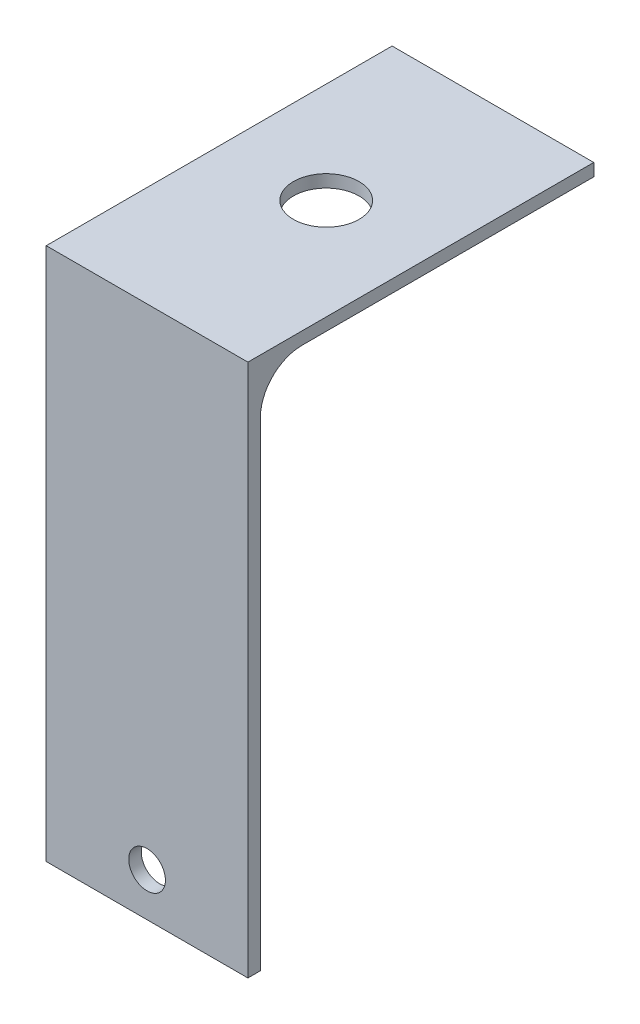
ISO-10303-21;
HEADER;
FILE_DESCRIPTION(('STEP AP214'),'2;1');
FILE_NAME('part.step','',(''),(''),'','','');
FILE_SCHEMA(('AUTOMOTIVE_DESIGN { 1 0 10303 214 1 1 1 1 }'));
ENDSEC;
DATA;
#1=APPLICATION_CONTEXT('core data for automotive mechanical design processes');
#2=APPLICATION_PROTOCOL_DEFINITION('international standard','automotive_design',2000,#1);
#3=PRODUCT_CONTEXT('',#1,'mechanical');
#4=PRODUCT('Part','Part','',(#3));
#5=PRODUCT_RELATED_PRODUCT_CATEGORY('part','',(#4));
#6=PRODUCT_DEFINITION_FORMATION('','',#4);
#7=PRODUCT_DEFINITION_CONTEXT('part definition',#1,'design');
#8=PRODUCT_DEFINITION('design','',#6,#7);
#9=PRODUCT_DEFINITION_SHAPE('','',#8);
#10=(LENGTH_UNIT() NAMED_UNIT(*) SI_UNIT(.MILLI.,.METRE.));
#11=(NAMED_UNIT(*) PLANE_ANGLE_UNIT() SI_UNIT($,.RADIAN.));
#12=(NAMED_UNIT(*) SI_UNIT($,.STERADIAN.) SOLID_ANGLE_UNIT());
#13=UNCERTAINTY_MEASURE_WITH_UNIT(LENGTH_MEASURE(1.E-05),#10,'distance_accuracy_value','');
#14=(GEOMETRIC_REPRESENTATION_CONTEXT(3) GLOBAL_UNCERTAINTY_ASSIGNED_CONTEXT((#13)) GLOBAL_UNIT_ASSIGNED_CONTEXT((#10,
#11,#12)) REPRESENTATION_CONTEXT('',''));
#15=CARTESIAN_POINT('',(0.,0.,0.));
#16=DIRECTION('',(0.,0.,1.));
#17=DIRECTION('',(1.,0.,0.));
#18=AXIS2_PLACEMENT_3D('',#15,#16,#17);
#19=CARTESIAN_POINT('',(0.,25.5,-5.));
#20=DIRECTION('',(-1.,0.,0.));
#21=DIRECTION('',(0.,0.,1.));
#22=AXIS2_PLACEMENT_3D('',#19,#20,#21);
#23=CYLINDRICAL_SURFACE('',#22,5.);
#24=DIRECTION('',(-1.,0.,0.));
#25=VECTOR('',#24,1.);
#26=CARTESIAN_POINT('',(0.,30.5,-5.));
#27=LINE('',#26,#25);
#28=CARTESIAN_POINT('',(12.1,30.5,-5.));
#29=VERTEX_POINT('',#28);
#30=CARTESIAN_POINT('',(-12.1,30.5,-5.));
#31=VERTEX_POINT('',#30);
#32=EDGE_CURVE('E183',#29,#31,#27,.T.);
#33=ORIENTED_EDGE('',*,*,#32,.F.);
#34=CARTESIAN_POINT('',(12.1,25.5,-5.));
#35=DIRECTION('',(-1.,0.,0.));
#36=DIRECTION('',(0.,0.,1.));
#37=AXIS2_PLACEMENT_3D('',#34,#35,#36);
#38=CIRCLE('',#37,5.);
#39=CARTESIAN_POINT('',(12.1,25.5,0.));
#40=VERTEX_POINT('',#39);
#41=EDGE_CURVE('E55',#29,#40,#38,.F.);
#42=ORIENTED_EDGE('',*,*,#41,.T.);
#43=DIRECTION('',(-1.,0.,0.));
#44=VECTOR('',#43,1.);
#45=CARTESIAN_POINT('',(0.,25.5,0.));
#46=LINE('',#45,#44);
#47=CARTESIAN_POINT('',(-12.1,25.5,0.));
#48=VERTEX_POINT('',#47);
#49=EDGE_CURVE('E186',#48,#40,#46,.F.);
#50=ORIENTED_EDGE('',*,*,#49,.F.);
#51=CARTESIAN_POINT('',(-12.1,25.5,-5.));
#52=DIRECTION('',(1.,0.,0.));
#53=DIRECTION('',(0.,0.,-1.));
#54=AXIS2_PLACEMENT_3D('',#51,#52,#53);
#55=CIRCLE('',#54,5.);
#56=EDGE_CURVE('E11',#48,#31,#55,.F.);
#57=ORIENTED_EDGE('',*,*,#56,.T.);
#58=EDGE_LOOP('',(#33,#42,#50,#57));
#59=FACE_BOUND('',#58,.T.);
#60=ADVANCED_FACE('F47',(#59),#23,.F.);
#61=CARTESIAN_POINT('',(-12.1,-32.,1.5));
#62=DIRECTION('',(1.,0.,0.));
#63=DIRECTION('',(0.,0.,-1.));
#64=AXIS2_PLACEMENT_3D('',#61,#62,#63);
#65=PLANE('',#64);
#66=ORIENTED_EDGE('',*,*,#56,.F.);
#67=DIRECTION('',(0.,-1.,0.));
#68=VECTOR('',#67,1.);
#69=CARTESIAN_POINT('',(-12.1,-32.,0.));
#70=LINE('',#69,#68);
#71=CARTESIAN_POINT('',(-12.1,-32.,0.));
#72=VERTEX_POINT('',#71);
#73=EDGE_CURVE('E144',#48,#72,#70,.T.);
#74=ORIENTED_EDGE('',*,*,#73,.T.);
#75=DIRECTION('',(0.,0.,-1.));
#76=VECTOR('',#75,1.);
#77=CARTESIAN_POINT('',(-12.1,-32.,1.5));
#78=LINE('',#77,#76);
#79=CARTESIAN_POINT('',(-12.1,-32.,1.5));
#80=VERTEX_POINT('',#79);
#81=EDGE_CURVE('E179',#80,#72,#78,.T.);
#82=ORIENTED_EDGE('',*,*,#81,.F.);
#83=DIRECTION('',(0.,-1.,0.));
#84=VECTOR('',#83,1.);
#85=CARTESIAN_POINT('',(-12.1,-32.,1.5));
#86=LINE('',#85,#84);
#87=CARTESIAN_POINT('',(-12.1,32.,1.5));
#88=VERTEX_POINT('',#87);
#89=EDGE_CURVE('E148',#88,#80,#86,.T.);
#90=ORIENTED_EDGE('',*,*,#89,.F.);
#91=DIRECTION('',(0.,0.,-1.));
#92=VECTOR('',#91,1.);
#93=CARTESIAN_POINT('',(-12.1,32.,1.5));
#94=LINE('',#93,#92);
#95=CARTESIAN_POINT('',(-12.1,32.,-40.));
#96=VERTEX_POINT('',#95);
#97=EDGE_CURVE('E162',#88,#96,#94,.T.);
#98=ORIENTED_EDGE('',*,*,#97,.T.);
#99=DIRECTION('',(0.,1.,0.));
#100=VECTOR('',#99,1.);
#101=CARTESIAN_POINT('',(-12.1,30.5,-40.));
#102=LINE('',#101,#100);
#103=CARTESIAN_POINT('',(-12.1,30.5,-40.));
#104=VERTEX_POINT('',#103);
#105=EDGE_CURVE('E124',#104,#96,#102,.T.);
#106=ORIENTED_EDGE('',*,*,#105,.F.);
#107=DIRECTION('',(0.,0.,1.));
#108=VECTOR('',#107,1.);
#109=CARTESIAN_POINT('',(-12.1,30.5,0.));
#110=LINE('',#109,#108);
#111=EDGE_CURVE('E115',#104,#31,#110,.T.);
#112=ORIENTED_EDGE('',*,*,#111,.T.);
#113=EDGE_LOOP('',(#66,#74,#82,#90,#98,#106,#112));
#114=FACE_BOUND('',#113,.T.);
#115=ADVANCED_FACE('F261',(#114),#65,.F.);
#116=CARTESIAN_POINT('',(12.1,-32.,1.5));
#117=DIRECTION('',(0.,1.,0.));
#118=DIRECTION('',(0.,0.,1.));
#119=AXIS2_PLACEMENT_3D('',#116,#117,#118);
#120=PLANE('',#119);
#121=DIRECTION('',(1.,0.,0.));
#122=VECTOR('',#121,1.);
#123=CARTESIAN_POINT('',(12.1,-32.,0.));
#124=LINE('',#123,#122);
#125=CARTESIAN_POINT('',(12.1,-32.,0.));
#126=VERTEX_POINT('',#125);
#127=EDGE_CURVE('E165',#72,#126,#124,.T.);
#128=ORIENTED_EDGE('',*,*,#127,.T.);
#129=DIRECTION('',(0.,0.,-1.));
#130=VECTOR('',#129,1.);
#131=CARTESIAN_POINT('',(12.1,-32.,1.5));
#132=LINE('',#131,#130);
#133=CARTESIAN_POINT('',(12.1,-32.,1.5));
#134=VERTEX_POINT('',#133);
#135=EDGE_CURVE('E175',#134,#126,#132,.T.);
#136=ORIENTED_EDGE('',*,*,#135,.F.);
#137=DIRECTION('',(1.,0.,0.));
#138=VECTOR('',#137,1.);
#139=CARTESIAN_POINT('',(12.1,-32.,1.5));
#140=LINE('',#139,#138);
#141=EDGE_CURVE('E152',#80,#134,#140,.T.);
#142=ORIENTED_EDGE('',*,*,#141,.F.);
#143=ORIENTED_EDGE('',*,*,#81,.T.);
#144=EDGE_LOOP('',(#128,#136,#142,#143));
#145=FACE_BOUND('',#144,.T.);
#146=ADVANCED_FACE('F265',(#145),#120,.F.);
#147=CARTESIAN_POINT('',(12.1,-32.,1.5));
#148=DIRECTION('',(-1.,0.,0.));
#149=DIRECTION('',(0.,0.,1.));
#150=AXIS2_PLACEMENT_3D('',#147,#148,#149);
#151=PLANE('',#150);
#152=ORIENTED_EDGE('',*,*,#41,.F.);
#153=DIRECTION('',(0.,0.,-1.));
#154=VECTOR('',#153,1.);
#155=CARTESIAN_POINT('',(12.1,30.5,0.));
#156=LINE('',#155,#154);
#157=CARTESIAN_POINT('',(12.1,30.5,-40.));
#158=VERTEX_POINT('',#157);
#159=EDGE_CURVE('E103',#29,#158,#156,.T.);
#160=ORIENTED_EDGE('',*,*,#159,.T.);
#161=DIRECTION('',(0.,1.,0.));
#162=VECTOR('',#161,1.);
#163=CARTESIAN_POINT('',(12.1,30.5,-40.));
#164=LINE('',#163,#162);
#165=CARTESIAN_POINT('',(12.1,32.,-40.));
#166=VERTEX_POINT('',#165);
#167=EDGE_CURVE('E107',#158,#166,#164,.T.);
#168=ORIENTED_EDGE('',*,*,#167,.T.);
#169=DIRECTION('',(0.,0.,-1.));
#170=VECTOR('',#169,1.);
#171=CARTESIAN_POINT('',(12.1,32.,1.5));
#172=LINE('',#171,#170);
#173=CARTESIAN_POINT('',(12.1,32.,1.5));
#174=VERTEX_POINT('',#173);
#175=EDGE_CURVE('E172',#174,#166,#172,.T.);
#176=ORIENTED_EDGE('',*,*,#175,.F.);
#177=DIRECTION('',(0.,1.,0.));
#178=VECTOR('',#177,1.);
#179=CARTESIAN_POINT('',(12.1,-32.,1.5));
#180=LINE('',#179,#178);
#181=EDGE_CURVE('E156',#134,#174,#180,.T.);
#182=ORIENTED_EDGE('',*,*,#181,.F.);
#183=ORIENTED_EDGE('',*,*,#135,.T.);
#184=DIRECTION('',(0.,1.,0.));
#185=VECTOR('',#184,1.);
#186=CARTESIAN_POINT('',(12.1,-32.,0.));
#187=LINE('',#186,#185);
#188=EDGE_CURVE('E153',#126,#40,#187,.T.);
#189=ORIENTED_EDGE('',*,*,#188,.T.);
#190=EDGE_LOOP('',(#152,#160,#168,#176,#182,#183,#189));
#191=FACE_BOUND('',#190,.T.);
#192=ADVANCED_FACE('F105',(#191),#151,.F.);
#193=CARTESIAN_POINT('',(12.1,32.,1.5));
#194=DIRECTION('',(0.,-1.,0.));
#195=DIRECTION('',(0.,0.,-1.));
#196=AXIS2_PLACEMENT_3D('',#193,#194,#195);
#197=PLANE('',#196);
#198=CARTESIAN_POINT('',(0.,32.,-20.));
#199=DIRECTION('',(0.,-1.,0.));
#200=DIRECTION('',(0.,0.,-1.));
#201=AXIS2_PLACEMENT_3D('',#198,#199,#200);
#202=CIRCLE('',#201,3.937);
#203=CARTESIAN_POINT('',(0.,32.,-23.937));
#204=VERTEX_POINT('',#203);
#205=EDGE_CURVE('E136',#204,#204,#202,.T.);
#206=ORIENTED_EDGE('',*,*,#205,.T.);
#207=EDGE_LOOP('',(#206));
#208=FACE_BOUND('',#207,.T.);
#209=ORIENTED_EDGE('',*,*,#175,.T.);
#210=DIRECTION('',(-1.,0.,0.));
#211=VECTOR('',#210,1.);
#212=CARTESIAN_POINT('',(-12.1,32.,-40.));
#213=LINE('',#212,#211);
#214=EDGE_CURVE('E122',#166,#96,#213,.T.);
#215=ORIENTED_EDGE('',*,*,#214,.T.);
#216=ORIENTED_EDGE('',*,*,#97,.F.);
#217=DIRECTION('',(-1.,0.,0.));
#218=VECTOR('',#217,1.);
#219=CARTESIAN_POINT('',(12.1,32.,1.5));
#220=LINE('',#219,#218);
#221=EDGE_CURVE('E159',#174,#88,#220,.T.);
#222=ORIENTED_EDGE('',*,*,#221,.F.);
#223=EDGE_LOOP('',(#209,#215,#216,#222));
#224=FACE_BOUND('',#223,.T.);
#225=ADVANCED_FACE('F269',(#208,#224),#197,.F.);
#226=CARTESIAN_POINT('',(0.,0.,1.5));
#227=DIRECTION('',(0.,0.,1.));
#228=DIRECTION('',(1.,0.,0.));
#229=AXIS2_PLACEMENT_3D('',#226,#227,#228);
#230=PLANE('',#229);
#231=CARTESIAN_POINT('',(0.,-26.8,1.5));
#232=DIRECTION('',(0.,0.,1.));
#233=DIRECTION('',(1.,0.,0.));
#234=AXIS2_PLACEMENT_3D('',#231,#232,#233);
#235=CIRCLE('',#234,2.2);
#236=CARTESIAN_POINT('',(2.2,-26.8,1.5));
#237=VERTEX_POINT('',#236);
#238=EDGE_CURVE('E138',#237,#237,#235,.T.);
#239=ORIENTED_EDGE('',*,*,#238,.F.);
#240=EDGE_LOOP('',(#239));
#241=FACE_BOUND('',#240,.T.);
#242=ORIENTED_EDGE('',*,*,#89,.T.);
#243=ORIENTED_EDGE('',*,*,#141,.T.);
#244=ORIENTED_EDGE('',*,*,#181,.T.);
#245=ORIENTED_EDGE('',*,*,#221,.T.);
#246=EDGE_LOOP('',(#242,#243,#244,#245));
#247=FACE_BOUND('',#246,.T.);
#248=ADVANCED_FACE('F275',(#241,#247),#230,.T.);
#249=CARTESIAN_POINT('',(0.,0.,0.));
#250=DIRECTION('',(0.,0.,1.));
#251=DIRECTION('',(1.,0.,0.));
#252=AXIS2_PLACEMENT_3D('',#249,#250,#251);
#253=PLANE('',#252);
#254=CARTESIAN_POINT('',(0.,-26.8,0.));
#255=DIRECTION('',(0.,0.,1.));
#256=DIRECTION('',(1.,0.,0.));
#257=AXIS2_PLACEMENT_3D('',#254,#255,#256);
#258=CIRCLE('',#257,2.2);
#259=CARTESIAN_POINT('',(2.2,-26.8,0.));
#260=VERTEX_POINT('',#259);
#261=EDGE_CURVE('E140',#260,#260,#258,.T.);
#262=ORIENTED_EDGE('',*,*,#261,.T.);
#263=EDGE_LOOP('',(#262));
#264=FACE_BOUND('',#263,.T.);
#265=ORIENTED_EDGE('',*,*,#73,.F.);
#266=ORIENTED_EDGE('',*,*,#49,.T.);
#267=ORIENTED_EDGE('',*,*,#188,.F.);
#268=ORIENTED_EDGE('',*,*,#127,.F.);
#269=EDGE_LOOP('',(#265,#266,#267,#268));
#270=FACE_BOUND('',#269,.T.);
#271=ADVANCED_FACE('F281',(#264,#270),#253,.F.);
#272=CARTESIAN_POINT('',(0.,-26.8,0.));
#273=DIRECTION('',(0.,0.,1.));
#274=DIRECTION('',(1.,0.,0.));
#275=AXIS2_PLACEMENT_3D('',#272,#273,#274);
#276=CYLINDRICAL_SURFACE('',#275,2.2);
#277=ORIENTED_EDGE('',*,*,#261,.F.);
#278=EDGE_LOOP('',(#277));
#279=FACE_BOUND('',#278,.T.);
#280=ORIENTED_EDGE('',*,*,#238,.T.);
#281=EDGE_LOOP('',(#280));
#282=FACE_BOUND('',#281,.T.);
#283=ADVANCED_FACE('F258',(#279,#282),#276,.F.);
#284=CARTESIAN_POINT('',(-12.1,30.5,-40.));
#285=DIRECTION('',(0.,0.,-1.));
#286=DIRECTION('',(-1.,0.,0.));
#287=AXIS2_PLACEMENT_3D('',#284,#285,#286);
#288=PLANE('',#287);
#289=ORIENTED_EDGE('',*,*,#214,.F.);
#290=ORIENTED_EDGE('',*,*,#167,.F.);
#291=DIRECTION('',(-1.,0.,0.));
#292=VECTOR('',#291,1.);
#293=CARTESIAN_POINT('',(-12.1,30.5,-40.));
#294=LINE('',#293,#292);
#295=EDGE_CURVE('E114',#158,#104,#294,.T.);
#296=ORIENTED_EDGE('',*,*,#295,.T.);
#297=ORIENTED_EDGE('',*,*,#105,.T.);
#298=EDGE_LOOP('',(#289,#290,#296,#297));
#299=FACE_BOUND('',#298,.T.);
#300=ADVANCED_FACE('F119',(#299),#288,.T.);
#301=CARTESIAN_POINT('',(0.,30.5,0.));
#302=DIRECTION('',(0.,-1.,0.));
#303=DIRECTION('',(0.,0.,-1.));
#304=AXIS2_PLACEMENT_3D('',#301,#302,#303);
#305=PLANE('',#304);
#306=CARTESIAN_POINT('',(0.,30.5,-20.));
#307=DIRECTION('',(0.,-1.,0.));
#308=DIRECTION('',(0.,0.,-1.));
#309=AXIS2_PLACEMENT_3D('',#306,#307,#308);
#310=CIRCLE('',#309,3.937);
#311=CARTESIAN_POINT('',(0.,30.5,-23.937));
#312=VERTEX_POINT('',#311);
#313=EDGE_CURVE('E238',#312,#312,#310,.T.);
#314=ORIENTED_EDGE('',*,*,#313,.F.);
#315=EDGE_LOOP('',(#314));
#316=FACE_BOUND('',#315,.T.);
#317=ORIENTED_EDGE('',*,*,#159,.F.);
#318=ORIENTED_EDGE('',*,*,#32,.T.);
#319=ORIENTED_EDGE('',*,*,#111,.F.);
#320=ORIENTED_EDGE('',*,*,#295,.F.);
#321=EDGE_LOOP('',(#317,#318,#319,#320));
#322=FACE_BOUND('',#321,.T.);
#323=ADVANCED_FACE('F127',(#316,#322),#305,.T.);
#324=CARTESIAN_POINT('',(0.,32.,-20.));
#325=DIRECTION('',(0.,-1.,0.));
#326=DIRECTION('',(0.,0.,-1.));
#327=AXIS2_PLACEMENT_3D('',#324,#325,#326);
#328=CYLINDRICAL_SURFACE('',#327,3.937);
#329=ORIENTED_EDGE('',*,*,#205,.F.);
#330=EDGE_LOOP('',(#329));
#331=FACE_BOUND('',#330,.T.);
#332=ORIENTED_EDGE('',*,*,#313,.T.);
#333=EDGE_LOOP('',(#332));
#334=FACE_BOUND('',#333,.T.);
#335=ADVANCED_FACE('F247',(#331,#334),#328,.F.);
#336=CLOSED_SHELL('',(#60,#115,#146,#192,#225,#248,#271,#283,#300,#323,#335));
#337=MANIFOLD_SOLID_BREP('B2',#336);
#338=ADVANCED_BREP_SHAPE_REPRESENTATION('',(#18,#337),#14);
#339=SHAPE_DEFINITION_REPRESENTATION(#9,#338);
ENDSEC;
END-ISO-10303-21;
